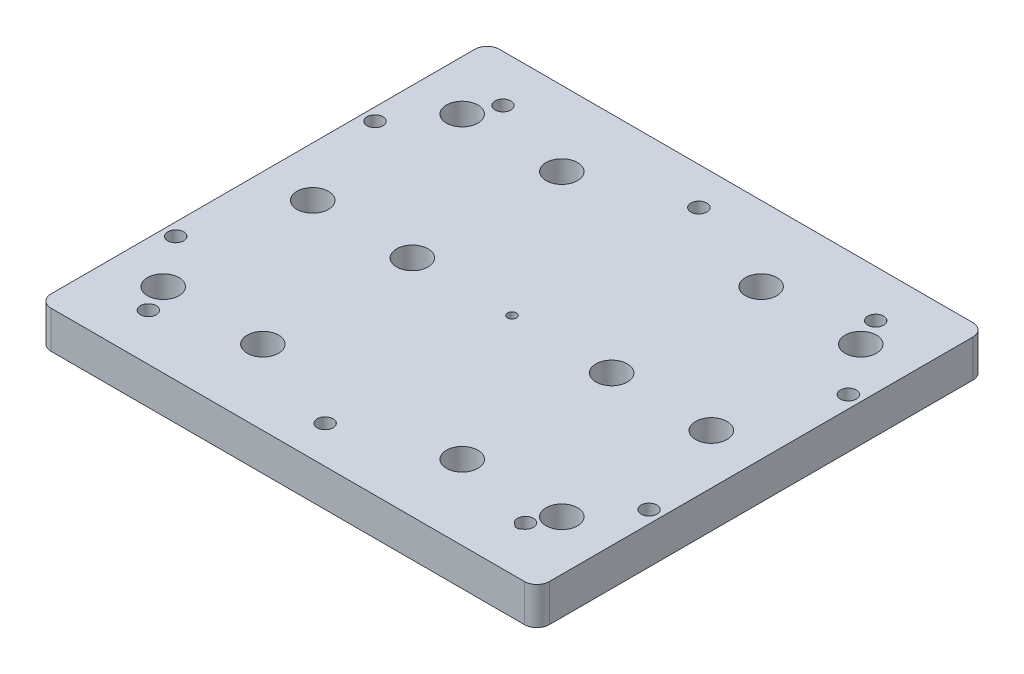
ISO-10303-21;
HEADER;
FILE_DESCRIPTION(('STEP AP214'),'2;1');
FILE_NAME('part.step','',(''),(''),'','','');
FILE_SCHEMA(('AUTOMOTIVE_DESIGN { 1 0 10303 214 1 1 1 1 }'));
ENDSEC;
DATA;
#1=APPLICATION_CONTEXT('core data for automotive mechanical design processes');
#2=APPLICATION_PROTOCOL_DEFINITION('international standard','automotive_design',2000,#1);
#3=PRODUCT_CONTEXT('',#1,'mechanical');
#4=PRODUCT('Part','Part','',(#3));
#5=PRODUCT_RELATED_PRODUCT_CATEGORY('part','',(#4));
#6=PRODUCT_DEFINITION_FORMATION('','',#4);
#7=PRODUCT_DEFINITION_CONTEXT('part definition',#1,'design');
#8=PRODUCT_DEFINITION('design','',#6,#7);
#9=PRODUCT_DEFINITION_SHAPE('','',#8);
#10=(LENGTH_UNIT() NAMED_UNIT(*) SI_UNIT(.MILLI.,.METRE.));
#11=(NAMED_UNIT(*) PLANE_ANGLE_UNIT() SI_UNIT($,.RADIAN.));
#12=(NAMED_UNIT(*) SI_UNIT($,.STERADIAN.) SOLID_ANGLE_UNIT());
#13=UNCERTAINTY_MEASURE_WITH_UNIT(LENGTH_MEASURE(1.E-05),#10,'distance_accuracy_value','');
#14=(GEOMETRIC_REPRESENTATION_CONTEXT(3) GLOBAL_UNCERTAINTY_ASSIGNED_CONTEXT((#13)) GLOBAL_UNIT_ASSIGNED_CONTEXT((#10,
#11,#12)) REPRESENTATION_CONTEXT('',''));
#15=CARTESIAN_POINT('',(0.,0.,0.));
#16=DIRECTION('',(0.,0.,1.));
#17=DIRECTION('',(1.,0.,0.));
#18=AXIS2_PLACEMENT_3D('',#15,#16,#17);
#19=CARTESIAN_POINT('',(-63.5,9.525,-57.15));
#20=DIRECTION('',(1.,0.,0.));
#21=DIRECTION('',(0.,0.,-1.));
#22=AXIS2_PLACEMENT_3D('',#19,#20,#21);
#23=PLANE('',#22);
#24=DIRECTION('',(0.,0.,1.));
#25=VECTOR('',#24,1.);
#26=CARTESIAN_POINT('',(-63.5,9.525,-57.15));
#27=LINE('',#26,#25);
#28=CARTESIAN_POINT('',(-63.5,9.525,-53.975));
#29=VERTEX_POINT('',#28);
#30=CARTESIAN_POINT('',(-63.5,9.525,53.975));
#31=VERTEX_POINT('',#30);
#32=EDGE_CURVE('E143',#29,#31,#27,.T.);
#33=ORIENTED_EDGE('',*,*,#32,.F.);
#34=DIRECTION('',(0.,-1.,0.));
#35=VECTOR('',#34,1.);
#36=CARTESIAN_POINT('',(-63.5,9.525,-53.975));
#37=LINE('',#36,#35);
#38=CARTESIAN_POINT('',(-63.5,0.,-53.975));
#39=VERTEX_POINT('',#38);
#40=EDGE_CURVE('E192',#29,#39,#37,.T.);
#41=ORIENTED_EDGE('',*,*,#40,.T.);
#42=DIRECTION('',(0.,0.,1.));
#43=VECTOR('',#42,1.);
#44=CARTESIAN_POINT('',(-63.5,0.,-57.15));
#45=LINE('',#44,#43);
#46=CARTESIAN_POINT('',(-63.5,0.,53.975));
#47=VERTEX_POINT('',#46);
#48=EDGE_CURVE('E142',#39,#47,#45,.T.);
#49=ORIENTED_EDGE('',*,*,#48,.T.);
#50=DIRECTION('',(0.,-1.,0.));
#51=VECTOR('',#50,1.);
#52=CARTESIAN_POINT('',(-63.5,9.525,53.975));
#53=LINE('',#52,#51);
#54=EDGE_CURVE('E190',#47,#31,#53,.F.);
#55=ORIENTED_EDGE('',*,*,#54,.T.);
#56=EDGE_LOOP('',(#33,#41,#49,#55));
#57=FACE_BOUND('',#56,.T.);
#58=ADVANCED_FACE('F37',(#57),#23,.F.);
#59=CARTESIAN_POINT('',(63.5,9.525,57.15));
#60=DIRECTION('',(0.,0.,-1.));
#61=DIRECTION('',(-1.,0.,0.));
#62=AXIS2_PLACEMENT_3D('',#59,#60,#61);
#63=PLANE('',#62);
#64=DIRECTION('',(1.,0.,0.));
#65=VECTOR('',#64,1.);
#66=CARTESIAN_POINT('',(63.5,0.,57.15));
#67=LINE('',#66,#65);
#68=CARTESIAN_POINT('',(-60.325,0.,57.15));
#69=VERTEX_POINT('',#68);
#70=CARTESIAN_POINT('',(60.325,0.,57.15));
#71=VERTEX_POINT('',#70);
#72=EDGE_CURVE('E158',#69,#71,#67,.T.);
#73=ORIENTED_EDGE('',*,*,#72,.T.);
#74=DIRECTION('',(0.,-1.,0.));
#75=VECTOR('',#74,1.);
#76=CARTESIAN_POINT('',(60.325,9.525,57.15));
#77=LINE('',#76,#75);
#78=CARTESIAN_POINT('',(60.325,9.525,57.15));
#79=VERTEX_POINT('',#78);
#80=EDGE_CURVE('E45',#71,#79,#77,.F.);
#81=ORIENTED_EDGE('',*,*,#80,.T.);
#82=DIRECTION('',(1.,0.,0.));
#83=VECTOR('',#82,1.);
#84=CARTESIAN_POINT('',(63.5,9.525,57.15));
#85=LINE('',#84,#83);
#86=CARTESIAN_POINT('',(-60.325,9.525,57.15));
#87=VERTEX_POINT('',#86);
#88=EDGE_CURVE('E146',#87,#79,#85,.T.);
#89=ORIENTED_EDGE('',*,*,#88,.F.);
#90=DIRECTION('',(0.,-1.,0.));
#91=VECTOR('',#90,1.);
#92=CARTESIAN_POINT('',(-60.325,9.525,57.15));
#93=LINE('',#92,#91);
#94=EDGE_CURVE('E195',#87,#69,#93,.T.);
#95=ORIENTED_EDGE('',*,*,#94,.T.);
#96=EDGE_LOOP('',(#73,#81,#89,#95));
#97=FACE_BOUND('',#96,.T.);
#98=ADVANCED_FACE('F199',(#97),#63,.F.);
#99=CARTESIAN_POINT('',(63.5,9.525,-57.15));
#100=DIRECTION('',(-1.,0.,0.));
#101=DIRECTION('',(0.,0.,1.));
#102=AXIS2_PLACEMENT_3D('',#99,#100,#101);
#103=PLANE('',#102);
#104=DIRECTION('',(0.,0.,-1.));
#105=VECTOR('',#104,1.);
#106=CARTESIAN_POINT('',(63.5,0.,-57.15));
#107=LINE('',#106,#105);
#108=CARTESIAN_POINT('',(63.5,0.,53.975));
#109=VERTEX_POINT('',#108);
#110=CARTESIAN_POINT('',(63.5,0.,-53.975));
#111=VERTEX_POINT('',#110);
#112=EDGE_CURVE('E160',#109,#111,#107,.T.);
#113=ORIENTED_EDGE('',*,*,#112,.T.);
#114=DIRECTION('',(0.,-1.,0.));
#115=VECTOR('',#114,1.);
#116=CARTESIAN_POINT('',(63.5,9.525,-53.975));
#117=LINE('',#116,#115);
#118=CARTESIAN_POINT('',(63.5,9.525,-53.975));
#119=VERTEX_POINT('',#118);
#120=EDGE_CURVE('E180',#111,#119,#117,.F.);
#121=ORIENTED_EDGE('',*,*,#120,.T.);
#122=DIRECTION('',(0.,0.,-1.));
#123=VECTOR('',#122,1.);
#124=CARTESIAN_POINT('',(63.5,9.525,-57.15));
#125=LINE('',#124,#123);
#126=CARTESIAN_POINT('',(63.5,9.525,53.975));
#127=VERTEX_POINT('',#126);
#128=EDGE_CURVE('E149',#127,#119,#125,.T.);
#129=ORIENTED_EDGE('',*,*,#128,.F.);
#130=DIRECTION('',(0.,-1.,0.));
#131=VECTOR('',#130,1.);
#132=CARTESIAN_POINT('',(63.5,9.525,53.975));
#133=LINE('',#132,#131);
#134=EDGE_CURVE('E177',#127,#109,#133,.T.);
#135=ORIENTED_EDGE('',*,*,#134,.T.);
#136=EDGE_LOOP('',(#113,#121,#129,#135));
#137=FACE_BOUND('',#136,.T.);
#138=ADVANCED_FACE('F213',(#137),#103,.F.);
#139=CARTESIAN_POINT('',(63.5,9.525,-57.15));
#140=DIRECTION('',(0.,0.,1.));
#141=DIRECTION('',(1.,0.,0.));
#142=AXIS2_PLACEMENT_3D('',#139,#140,#141);
#143=PLANE('',#142);
#144=DIRECTION('',(-1.,0.,0.));
#145=VECTOR('',#144,1.);
#146=CARTESIAN_POINT('',(63.5,9.525,-57.15));
#147=LINE('',#146,#145);
#148=CARTESIAN_POINT('',(60.325,9.525,-57.15));
#149=VERTEX_POINT('',#148);
#150=CARTESIAN_POINT('',(-60.325,9.525,-57.15));
#151=VERTEX_POINT('',#150);
#152=EDGE_CURVE('E152',#149,#151,#147,.T.);
#153=ORIENTED_EDGE('',*,*,#152,.F.);
#154=DIRECTION('',(0.,-1.,0.));
#155=VECTOR('',#154,1.);
#156=CARTESIAN_POINT('',(60.325,9.525,-57.15));
#157=LINE('',#156,#155);
#158=CARTESIAN_POINT('',(60.325,0.,-57.15));
#159=VERTEX_POINT('',#158);
#160=EDGE_CURVE('E166',#149,#159,#157,.T.);
#161=ORIENTED_EDGE('',*,*,#160,.T.);
#162=DIRECTION('',(-1.,0.,0.));
#163=VECTOR('',#162,1.);
#164=CARTESIAN_POINT('',(63.5,0.,-57.15));
#165=LINE('',#164,#163);
#166=CARTESIAN_POINT('',(-60.325,0.,-57.15));
#167=VERTEX_POINT('',#166);
#168=EDGE_CURVE('E147',#159,#167,#165,.T.);
#169=ORIENTED_EDGE('',*,*,#168,.T.);
#170=DIRECTION('',(0.,-1.,0.));
#171=VECTOR('',#170,1.);
#172=CARTESIAN_POINT('',(-60.325,9.525,-57.15));
#173=LINE('',#172,#171);
#174=EDGE_CURVE('E155',#167,#151,#173,.F.);
#175=ORIENTED_EDGE('',*,*,#174,.T.);
#176=EDGE_LOOP('',(#153,#161,#169,#175));
#177=FACE_BOUND('',#176,.T.);
#178=ADVANCED_FACE('F222',(#177),#143,.F.);
#179=CARTESIAN_POINT('',(0.,9.525,0.));
#180=DIRECTION('',(0.,-1.,0.));
#181=DIRECTION('',(0.,0.,-1.));
#182=AXIS2_PLACEMENT_3D('',#179,#180,#181);
#183=PLANE('',#182);
#184=CARTESIAN_POINT('',(50.8,9.525,-38.1));
#185=DIRECTION('',(0.,-1.,0.));
#186=DIRECTION('',(0.,0.,-1.));
#187=AXIS2_PLACEMENT_3D('',#184,#185,#186);
#188=CIRCLE('',#187,4.0132);
#189=CARTESIAN_POINT('',(50.8,9.525,-42.1132));
#190=VERTEX_POINT('',#189);
#191=EDGE_CURVE('E558',#190,#190,#188,.T.);
#192=ORIENTED_EDGE('',*,*,#191,.T.);
#193=EDGE_LOOP('',(#192));
#194=FACE_BOUND('',#193,.T.);
#195=CARTESIAN_POINT('',(25.4,9.525,-38.1));
#196=DIRECTION('',(0.,-1.,0.));
#197=DIRECTION('',(0.,0.,-1.));
#198=AXIS2_PLACEMENT_3D('',#195,#196,#197);
#199=CIRCLE('',#198,4.0132);
#200=CARTESIAN_POINT('',(25.4,9.525,-42.1132));
#201=VERTEX_POINT('',#200);
#202=EDGE_CURVE('E568',#201,#201,#199,.T.);
#203=ORIENTED_EDGE('',*,*,#202,.T.);
#204=EDGE_LOOP('',(#203));
#205=FACE_BOUND('',#204,.T.);
#206=CARTESIAN_POINT('',(25.4,9.525,0.));
#207=DIRECTION('',(0.,-1.,0.));
#208=DIRECTION('',(0.,0.,-1.));
#209=AXIS2_PLACEMENT_3D('',#206,#207,#208);
#210=CIRCLE('',#209,4.0132);
#211=CARTESIAN_POINT('',(25.4,9.525,-4.0132));
#212=VERTEX_POINT('',#211);
#213=EDGE_CURVE('E574',#212,#212,#210,.T.);
#214=ORIENTED_EDGE('',*,*,#213,.T.);
#215=EDGE_LOOP('',(#214));
#216=FACE_BOUND('',#215,.T.);
#217=CARTESIAN_POINT('',(50.8,9.525,0.));
#218=DIRECTION('',(0.,-1.,0.));
#219=DIRECTION('',(0.,0.,-1.));
#220=AXIS2_PLACEMENT_3D('',#217,#218,#219);
#221=CIRCLE('',#220,4.01319999999999);
#222=CARTESIAN_POINT('',(50.8,9.525,-4.01319999999999));
#223=VERTEX_POINT('',#222);
#224=EDGE_CURVE('E580',#223,#223,#221,.T.);
#225=ORIENTED_EDGE('',*,*,#224,.T.);
#226=EDGE_LOOP('',(#225));
#227=FACE_BOUND('',#226,.T.);
#228=CARTESIAN_POINT('',(50.8,9.525,38.1));
#229=DIRECTION('',(0.,-1.,0.));
#230=DIRECTION('',(0.,0.,-1.));
#231=AXIS2_PLACEMENT_3D('',#228,#229,#230);
#232=CIRCLE('',#231,4.01319999999999);
#233=CARTESIAN_POINT('',(50.8,9.525,34.0868));
#234=VERTEX_POINT('',#233);
#235=EDGE_CURVE('E586',#234,#234,#232,.T.);
#236=ORIENTED_EDGE('',*,*,#235,.T.);
#237=EDGE_LOOP('',(#236));
#238=FACE_BOUND('',#237,.T.);
#239=CARTESIAN_POINT('',(25.4,9.525,38.1));
#240=DIRECTION('',(0.,-1.,0.));
#241=DIRECTION('',(0.,0.,-1.));
#242=AXIS2_PLACEMENT_3D('',#239,#240,#241);
#243=CIRCLE('',#242,4.0132);
#244=CARTESIAN_POINT('',(25.4,9.525,34.0868));
#245=VERTEX_POINT('',#244);
#246=EDGE_CURVE('E592',#245,#245,#243,.T.);
#247=ORIENTED_EDGE('',*,*,#246,.T.);
#248=EDGE_LOOP('',(#247));
#249=FACE_BOUND('',#248,.T.);
#250=CARTESIAN_POINT('',(-25.4,9.525,38.1));
#251=DIRECTION('',(0.,-1.,0.));
#252=DIRECTION('',(0.,0.,-1.));
#253=AXIS2_PLACEMENT_3D('',#250,#251,#252);
#254=CIRCLE('',#253,4.0132);
#255=CARTESIAN_POINT('',(-25.4,9.525,34.0868));
#256=VERTEX_POINT('',#255);
#257=EDGE_CURVE('E598',#256,#256,#254,.T.);
#258=ORIENTED_EDGE('',*,*,#257,.T.);
#259=EDGE_LOOP('',(#258));
#260=FACE_BOUND('',#259,.T.);
#261=CARTESIAN_POINT('',(-50.8,9.525,38.1));
#262=DIRECTION('',(0.,-1.,0.));
#263=DIRECTION('',(0.,0.,-1.));
#264=AXIS2_PLACEMENT_3D('',#261,#262,#263);
#265=CIRCLE('',#264,4.01319999999999);
#266=CARTESIAN_POINT('',(-50.8,9.525,34.0868));
#267=VERTEX_POINT('',#266);
#268=EDGE_CURVE('E604',#267,#267,#265,.T.);
#269=ORIENTED_EDGE('',*,*,#268,.T.);
#270=EDGE_LOOP('',(#269));
#271=FACE_BOUND('',#270,.T.);
#272=CARTESIAN_POINT('',(-50.8,9.525,0.));
#273=DIRECTION('',(0.,-1.,0.));
#274=DIRECTION('',(0.,0.,-1.));
#275=AXIS2_PLACEMENT_3D('',#272,#273,#274);
#276=CIRCLE('',#275,4.01319999999999);
#277=CARTESIAN_POINT('',(-50.8,9.525,-4.01319999999999));
#278=VERTEX_POINT('',#277);
#279=EDGE_CURVE('E610',#278,#278,#276,.T.);
#280=ORIENTED_EDGE('',*,*,#279,.T.);
#281=EDGE_LOOP('',(#280));
#282=FACE_BOUND('',#281,.T.);
#283=CARTESIAN_POINT('',(-25.4,9.525,0.));
#284=DIRECTION('',(0.,-1.,0.));
#285=DIRECTION('',(0.,0.,-1.));
#286=AXIS2_PLACEMENT_3D('',#283,#284,#285);
#287=CIRCLE('',#286,4.0132);
#288=CARTESIAN_POINT('',(-25.4,9.525,-4.0132));
#289=VERTEX_POINT('',#288);
#290=EDGE_CURVE('E616',#289,#289,#287,.T.);
#291=ORIENTED_EDGE('',*,*,#290,.T.);
#292=EDGE_LOOP('',(#291));
#293=FACE_BOUND('',#292,.T.);
#294=CARTESIAN_POINT('',(-25.4,9.525,-38.1));
#295=DIRECTION('',(0.,-1.,0.));
#296=DIRECTION('',(0.,0.,-1.));
#297=AXIS2_PLACEMENT_3D('',#294,#295,#296);
#298=CIRCLE('',#297,4.0132);
#299=CARTESIAN_POINT('',(-25.4,9.525,-42.1132));
#300=VERTEX_POINT('',#299);
#301=EDGE_CURVE('E622',#300,#300,#298,.T.);
#302=ORIENTED_EDGE('',*,*,#301,.T.);
#303=EDGE_LOOP('',(#302));
#304=FACE_BOUND('',#303,.T.);
#305=CARTESIAN_POINT('',(-50.8,9.525,-38.1));
#306=DIRECTION('',(0.,-1.,0.));
#307=DIRECTION('',(0.,0.,-1.));
#308=AXIS2_PLACEMENT_3D('',#305,#306,#307);
#309=CIRCLE('',#308,4.01319999999999);
#310=CARTESIAN_POINT('',(-50.8,9.525,-42.1132));
#311=VERTEX_POINT('',#310);
#312=EDGE_CURVE('E628',#311,#311,#309,.T.);
#313=ORIENTED_EDGE('',*,*,#312,.T.);
#314=EDGE_LOOP('',(#313));
#315=FACE_BOUND('',#314,.T.);
#316=CARTESIAN_POINT('',(47.499999996,9.525,-45.200000024));
#317=DIRECTION('',(0.,-1.,0.));
#318=DIRECTION('',(0.,0.,-1.));
#319=AXIS2_PLACEMENT_3D('',#316,#317,#318);
#320=CIRCLE('',#319,2.0193);
#321=CARTESIAN_POINT('',(47.499999996,9.525,-47.219300024));
#322=VERTEX_POINT('',#321);
#323=EDGE_CURVE('E634',#322,#322,#320,.T.);
#324=ORIENTED_EDGE('',*,*,#323,.T.);
#325=EDGE_LOOP('',(#324));
#326=FACE_BOUND('',#325,.T.);
#327=CARTESIAN_POINT('',(60.325,9.525,-25.4));
#328=DIRECTION('',(0.,-1.,0.));
#329=DIRECTION('',(0.,0.,-1.));
#330=AXIS2_PLACEMENT_3D('',#327,#328,#329);
#331=CIRCLE('',#330,2.01929999999999);
#332=CARTESIAN_POINT('',(60.325,9.525,-27.4193));
#333=VERTEX_POINT('',#332);
#334=EDGE_CURVE('E640',#333,#333,#331,.T.);
#335=ORIENTED_EDGE('',*,*,#334,.T.);
#336=EDGE_LOOP('',(#335));
#337=FACE_BOUND('',#336,.T.);
#338=CARTESIAN_POINT('',(60.325,9.525,25.4));
#339=DIRECTION('',(0.,-1.,0.));
#340=DIRECTION('',(0.,0.,-1.));
#341=AXIS2_PLACEMENT_3D('',#338,#339,#340);
#342=CIRCLE('',#341,2.0193);
#343=CARTESIAN_POINT('',(60.325,9.525,23.3807));
#344=VERTEX_POINT('',#343);
#345=EDGE_CURVE('E646',#344,#344,#342,.T.);
#346=ORIENTED_EDGE('',*,*,#345,.T.);
#347=EDGE_LOOP('',(#346));
#348=FACE_BOUND('',#347,.T.);
#349=CARTESIAN_POINT('',(0.,9.525,47.625));
#350=DIRECTION('',(0.,-1.,0.));
#351=DIRECTION('',(0.,0.,-1.));
#352=AXIS2_PLACEMENT_3D('',#349,#350,#351);
#353=CIRCLE('',#352,2.0193);
#354=CARTESIAN_POINT('',(0.,9.525,45.6057));
#355=VERTEX_POINT('',#354);
#356=EDGE_CURVE('E654',#355,#355,#353,.T.);
#357=ORIENTED_EDGE('',*,*,#356,.T.);
#358=EDGE_LOOP('',(#357));
#359=FACE_BOUND('',#358,.T.);
#360=CARTESIAN_POINT('',(-47.499999996,9.525,45.200000024));
#361=DIRECTION('',(0.,-1.,0.));
#362=DIRECTION('',(0.,0.,-1.));
#363=AXIS2_PLACEMENT_3D('',#360,#361,#362);
#364=CIRCLE('',#363,2.01929999999999);
#365=CARTESIAN_POINT('',(-47.499999996,9.525,43.180700024));
#366=VERTEX_POINT('',#365);
#367=EDGE_CURVE('E660',#366,#366,#364,.T.);
#368=ORIENTED_EDGE('',*,*,#367,.T.);
#369=EDGE_LOOP('',(#368));
#370=FACE_BOUND('',#369,.T.);
#371=CARTESIAN_POINT('',(-60.325,9.525,25.4));
#372=DIRECTION('',(0.,-1.,0.));
#373=DIRECTION('',(0.,0.,-1.));
#374=AXIS2_PLACEMENT_3D('',#371,#372,#373);
#375=CIRCLE('',#374,2.01929999999999);
#376=CARTESIAN_POINT('',(-60.325,9.525,23.3807));
#377=VERTEX_POINT('',#376);
#378=EDGE_CURVE('E666',#377,#377,#375,.T.);
#379=ORIENTED_EDGE('',*,*,#378,.T.);
#380=EDGE_LOOP('',(#379));
#381=FACE_BOUND('',#380,.T.);
#382=CARTESIAN_POINT('',(-60.325,9.525,-25.4));
#383=DIRECTION('',(0.,-1.,0.));
#384=DIRECTION('',(0.,0.,-1.));
#385=AXIS2_PLACEMENT_3D('',#382,#383,#384);
#386=CIRCLE('',#385,2.01929999999999);
#387=CARTESIAN_POINT('',(-60.325,9.525,-27.4193));
#388=VERTEX_POINT('',#387);
#389=EDGE_CURVE('E672',#388,#388,#386,.T.);
#390=ORIENTED_EDGE('',*,*,#389,.T.);
#391=EDGE_LOOP('',(#390));
#392=FACE_BOUND('',#391,.T.);
#393=CARTESIAN_POINT('',(-47.499999996,9.525,-45.200000024));
#394=DIRECTION('',(0.,-1.,0.));
#395=DIRECTION('',(0.,0.,-1.));
#396=AXIS2_PLACEMENT_3D('',#393,#394,#395);
#397=CIRCLE('',#396,2.01929999999999);
#398=CARTESIAN_POINT('',(-47.499999996,9.525,-47.219300024));
#399=VERTEX_POINT('',#398);
#400=EDGE_CURVE('E678',#399,#399,#397,.T.);
#401=ORIENTED_EDGE('',*,*,#400,.T.);
#402=EDGE_LOOP('',(#401));
#403=FACE_BOUND('',#402,.T.);
#404=CARTESIAN_POINT('',(0.,9.525,-47.625));
#405=DIRECTION('',(0.,-1.,0.));
#406=DIRECTION('',(0.,0.,-1.));
#407=AXIS2_PLACEMENT_3D('',#404,#405,#406);
#408=CIRCLE('',#407,2.0193);
#409=CARTESIAN_POINT('',(0.,9.525,-49.6443));
#410=VERTEX_POINT('',#409);
#411=EDGE_CURVE('E128',#410,#410,#408,.T.);
#412=ORIENTED_EDGE('',*,*,#411,.T.);
#413=EDGE_LOOP('',(#412));
#414=FACE_BOUND('',#413,.T.);
#415=CARTESIAN_POINT('',(47.499999996,9.525,45.200000024));
#416=DIRECTION('',(0.,1.,0.));
#417=DIRECTION('',(0.,0.,1.));
#418=AXIS2_PLACEMENT_3D('',#415,#416,#417);
#419=CIRCLE('',#418,1.1303);
#420=CARTESIAN_POINT('',(46.5922367519601,9.525,45.873456765573));
#421=VERTEX_POINT('',#420);
#422=CARTESIAN_POINT('',(48.4077632400399,9.525,45.873456765573));
#423=VERTEX_POINT('',#422);
#424=EDGE_CURVE('E121',#421,#423,#419,.T.);
#425=ORIENTED_EDGE('',*,*,#424,.F.);
#426=CARTESIAN_POINT('',(47.499999996,9.525,44.069700024));
#427=DIRECTION('',(0.,-1.,0.));
#428=DIRECTION('',(0.,0.,-1.));
#429=AXIS2_PLACEMENT_3D('',#426,#427,#428);
#430=CIRCLE('',#429,2.0193);
#431=EDGE_CURVE('E11',#421,#423,#430,.T.);
#432=ORIENTED_EDGE('',*,*,#431,.T.);
#433=EDGE_LOOP('',(#425,#432));
#434=FACE_BOUND('',#433,.T.);
#435=CARTESIAN_POINT('',(0.,9.525,0.));
#436=DIRECTION('',(0.,1.,0.));
#437=DIRECTION('',(0.,0.,1.));
#438=AXIS2_PLACEMENT_3D('',#435,#436,#437);
#439=CIRCLE('',#438,1.1303);
#440=CARTESIAN_POINT('',(0.,9.525,1.1303));
#441=VERTEX_POINT('',#440);
#442=EDGE_CURVE('E130',#441,#441,#439,.T.);
#443=ORIENTED_EDGE('',*,*,#442,.F.);
#444=EDGE_LOOP('',(#443));
#445=FACE_BOUND('',#444,.T.);
#446=ORIENTED_EDGE('',*,*,#128,.T.);
#447=CARTESIAN_POINT('',(60.325,9.525,-53.975));
#448=DIRECTION('',(0.,-1.,0.));
#449=DIRECTION('',(0.,0.,-1.));
#450=AXIS2_PLACEMENT_3D('',#447,#448,#449);
#451=CIRCLE('',#450,3.175);
#452=EDGE_CURVE('E188',#119,#149,#451,.F.);
#453=ORIENTED_EDGE('',*,*,#452,.T.);
#454=ORIENTED_EDGE('',*,*,#152,.T.);
#455=CARTESIAN_POINT('',(-60.325,9.525,-53.975));
#456=DIRECTION('',(0.,-1.,0.));
#457=DIRECTION('',(0.,0.,-1.));
#458=AXIS2_PLACEMENT_3D('',#455,#456,#457);
#459=CIRCLE('',#458,3.175);
#460=EDGE_CURVE('E186',#151,#29,#459,.F.);
#461=ORIENTED_EDGE('',*,*,#460,.T.);
#462=ORIENTED_EDGE('',*,*,#32,.T.);
#463=CARTESIAN_POINT('',(-60.325,9.525,53.975));
#464=DIRECTION('',(0.,-1.,0.));
#465=DIRECTION('',(0.,0.,-1.));
#466=AXIS2_PLACEMENT_3D('',#463,#464,#465);
#467=CIRCLE('',#466,3.175);
#468=EDGE_CURVE('E182',#31,#87,#467,.F.);
#469=ORIENTED_EDGE('',*,*,#468,.T.);
#470=ORIENTED_EDGE('',*,*,#88,.T.);
#471=CARTESIAN_POINT('',(60.325,9.525,53.975));
#472=DIRECTION('',(0.,-1.,0.));
#473=DIRECTION('',(0.,0.,-1.));
#474=AXIS2_PLACEMENT_3D('',#471,#472,#473);
#475=CIRCLE('',#474,3.175);
#476=EDGE_CURVE('E184',#79,#127,#475,.F.);
#477=ORIENTED_EDGE('',*,*,#476,.T.);
#478=EDGE_LOOP('',(#446,#453,#454,#461,#462,#469,#470,#477));
#479=FACE_BOUND('',#478,.T.);
#480=ADVANCED_FACE('F126',(#194,#205,#216,#227,#238,#249,#260,#271,#282,#293,#304,#315,#326,
#337,#348,#359,#370,#381,#392,#403,#414,#434,#445,#479),#183,.F.);
#481=CARTESIAN_POINT('',(0.,0.,0.));
#482=DIRECTION('',(0.,-1.,0.));
#483=DIRECTION('',(0.,0.,-1.));
#484=AXIS2_PLACEMENT_3D('',#481,#482,#483);
#485=PLANE('',#484);
#486=CARTESIAN_POINT('',(50.8,0.,-38.1));
#487=DIRECTION('',(0.,-1.,0.));
#488=DIRECTION('',(0.,0.,-1.));
#489=AXIS2_PLACEMENT_3D('',#486,#487,#488);
#490=CIRCLE('',#489,4.0132);
#491=CARTESIAN_POINT('',(50.8,0.,-42.1132));
#492=VERTEX_POINT('',#491);
#493=EDGE_CURVE('E561',#492,#492,#490,.T.);
#494=ORIENTED_EDGE('',*,*,#493,.F.);
#495=EDGE_LOOP('',(#494));
#496=FACE_BOUND('',#495,.T.);
#497=CARTESIAN_POINT('',(25.4,0.,-38.1));
#498=DIRECTION('',(0.,-1.,0.));
#499=DIRECTION('',(0.,0.,-1.));
#500=AXIS2_PLACEMENT_3D('',#497,#498,#499);
#501=CIRCLE('',#500,4.0132);
#502=CARTESIAN_POINT('',(25.4,0.,-42.1132));
#503=VERTEX_POINT('',#502);
#504=EDGE_CURVE('E563',#503,#503,#501,.T.);
#505=ORIENTED_EDGE('',*,*,#504,.F.);
#506=EDGE_LOOP('',(#505));
#507=FACE_BOUND('',#506,.T.);
#508=CARTESIAN_POINT('',(25.4,0.,0.));
#509=DIRECTION('',(0.,-1.,0.));
#510=DIRECTION('',(0.,0.,-1.));
#511=AXIS2_PLACEMENT_3D('',#508,#509,#510);
#512=CIRCLE('',#511,4.0132);
#513=CARTESIAN_POINT('',(25.4,0.,-4.0132));
#514=VERTEX_POINT('',#513);
#515=EDGE_CURVE('E571',#514,#514,#512,.T.);
#516=ORIENTED_EDGE('',*,*,#515,.F.);
#517=EDGE_LOOP('',(#516));
#518=FACE_BOUND('',#517,.T.);
#519=CARTESIAN_POINT('',(50.8,0.,0.));
#520=DIRECTION('',(0.,-1.,0.));
#521=DIRECTION('',(0.,0.,-1.));
#522=AXIS2_PLACEMENT_3D('',#519,#520,#521);
#523=CIRCLE('',#522,4.0132);
#524=CARTESIAN_POINT('',(50.8,0.,-4.0132));
#525=VERTEX_POINT('',#524);
#526=EDGE_CURVE('E577',#525,#525,#523,.T.);
#527=ORIENTED_EDGE('',*,*,#526,.F.);
#528=EDGE_LOOP('',(#527));
#529=FACE_BOUND('',#528,.T.);
#530=CARTESIAN_POINT('',(50.8,0.,38.1));
#531=DIRECTION('',(0.,-1.,0.));
#532=DIRECTION('',(0.,0.,-1.));
#533=AXIS2_PLACEMENT_3D('',#530,#531,#532);
#534=CIRCLE('',#533,4.0132);
#535=CARTESIAN_POINT('',(50.8,0.,34.0868));
#536=VERTEX_POINT('',#535);
#537=EDGE_CURVE('E583',#536,#536,#534,.T.);
#538=ORIENTED_EDGE('',*,*,#537,.F.);
#539=EDGE_LOOP('',(#538));
#540=FACE_BOUND('',#539,.T.);
#541=CARTESIAN_POINT('',(25.4,0.,38.1));
#542=DIRECTION('',(0.,-1.,0.));
#543=DIRECTION('',(0.,0.,-1.));
#544=AXIS2_PLACEMENT_3D('',#541,#542,#543);
#545=CIRCLE('',#544,4.0132);
#546=CARTESIAN_POINT('',(25.4,0.,34.0868));
#547=VERTEX_POINT('',#546);
#548=EDGE_CURVE('E589',#547,#547,#545,.T.);
#549=ORIENTED_EDGE('',*,*,#548,.F.);
#550=EDGE_LOOP('',(#549));
#551=FACE_BOUND('',#550,.T.);
#552=CARTESIAN_POINT('',(-25.4,0.,38.1));
#553=DIRECTION('',(0.,-1.,0.));
#554=DIRECTION('',(0.,0.,-1.));
#555=AXIS2_PLACEMENT_3D('',#552,#553,#554);
#556=CIRCLE('',#555,4.0132);
#557=CARTESIAN_POINT('',(-25.4,0.,34.0868));
#558=VERTEX_POINT('',#557);
#559=EDGE_CURVE('E595',#558,#558,#556,.T.);
#560=ORIENTED_EDGE('',*,*,#559,.F.);
#561=EDGE_LOOP('',(#560));
#562=FACE_BOUND('',#561,.T.);
#563=CARTESIAN_POINT('',(-50.8,0.,38.1));
#564=DIRECTION('',(0.,-1.,0.));
#565=DIRECTION('',(0.,0.,-1.));
#566=AXIS2_PLACEMENT_3D('',#563,#564,#565);
#567=CIRCLE('',#566,4.0132);
#568=CARTESIAN_POINT('',(-50.8,0.,34.0868));
#569=VERTEX_POINT('',#568);
#570=EDGE_CURVE('E601',#569,#569,#567,.T.);
#571=ORIENTED_EDGE('',*,*,#570,.F.);
#572=EDGE_LOOP('',(#571));
#573=FACE_BOUND('',#572,.T.);
#574=CARTESIAN_POINT('',(-50.8,0.,0.));
#575=DIRECTION('',(0.,-1.,0.));
#576=DIRECTION('',(0.,0.,-1.));
#577=AXIS2_PLACEMENT_3D('',#574,#575,#576);
#578=CIRCLE('',#577,4.0132);
#579=CARTESIAN_POINT('',(-50.8,0.,-4.0132));
#580=VERTEX_POINT('',#579);
#581=EDGE_CURVE('E607',#580,#580,#578,.T.);
#582=ORIENTED_EDGE('',*,*,#581,.F.);
#583=EDGE_LOOP('',(#582));
#584=FACE_BOUND('',#583,.T.);
#585=CARTESIAN_POINT('',(-25.4,0.,0.));
#586=DIRECTION('',(0.,-1.,0.));
#587=DIRECTION('',(0.,0.,-1.));
#588=AXIS2_PLACEMENT_3D('',#585,#586,#587);
#589=CIRCLE('',#588,4.0132);
#590=CARTESIAN_POINT('',(-25.4,0.,-4.0132));
#591=VERTEX_POINT('',#590);
#592=EDGE_CURVE('E613',#591,#591,#589,.T.);
#593=ORIENTED_EDGE('',*,*,#592,.F.);
#594=EDGE_LOOP('',(#593));
#595=FACE_BOUND('',#594,.T.);
#596=CARTESIAN_POINT('',(-25.4,0.,-38.1));
#597=DIRECTION('',(0.,-1.,0.));
#598=DIRECTION('',(0.,0.,-1.));
#599=AXIS2_PLACEMENT_3D('',#596,#597,#598);
#600=CIRCLE('',#599,4.0132);
#601=CARTESIAN_POINT('',(-25.4,0.,-42.1132));
#602=VERTEX_POINT('',#601);
#603=EDGE_CURVE('E619',#602,#602,#600,.T.);
#604=ORIENTED_EDGE('',*,*,#603,.F.);
#605=EDGE_LOOP('',(#604));
#606=FACE_BOUND('',#605,.T.);
#607=CARTESIAN_POINT('',(-50.8,0.,-38.1));
#608=DIRECTION('',(0.,-1.,0.));
#609=DIRECTION('',(0.,0.,-1.));
#610=AXIS2_PLACEMENT_3D('',#607,#608,#609);
#611=CIRCLE('',#610,4.0132);
#612=CARTESIAN_POINT('',(-50.8,0.,-42.1132));
#613=VERTEX_POINT('',#612);
#614=EDGE_CURVE('E625',#613,#613,#611,.T.);
#615=ORIENTED_EDGE('',*,*,#614,.F.);
#616=EDGE_LOOP('',(#615));
#617=FACE_BOUND('',#616,.T.);
#618=CARTESIAN_POINT('',(47.499999996,0.,-45.200000024));
#619=DIRECTION('',(0.,-1.,0.));
#620=DIRECTION('',(0.,0.,-1.));
#621=AXIS2_PLACEMENT_3D('',#618,#619,#620);
#622=CIRCLE('',#621,2.0193);
#623=CARTESIAN_POINT('',(47.499999996,0.,-47.219300024));
#624=VERTEX_POINT('',#623);
#625=EDGE_CURVE('E631',#624,#624,#622,.T.);
#626=ORIENTED_EDGE('',*,*,#625,.F.);
#627=EDGE_LOOP('',(#626));
#628=FACE_BOUND('',#627,.T.);
#629=CARTESIAN_POINT('',(60.325,0.,-25.4));
#630=DIRECTION('',(0.,-1.,0.));
#631=DIRECTION('',(0.,0.,-1.));
#632=AXIS2_PLACEMENT_3D('',#629,#630,#631);
#633=CIRCLE('',#632,2.0193);
#634=CARTESIAN_POINT('',(60.325,0.,-27.4193));
#635=VERTEX_POINT('',#634);
#636=EDGE_CURVE('E637',#635,#635,#633,.T.);
#637=ORIENTED_EDGE('',*,*,#636,.F.);
#638=EDGE_LOOP('',(#637));
#639=FACE_BOUND('',#638,.T.);
#640=CARTESIAN_POINT('',(60.325,0.,25.4));
#641=DIRECTION('',(0.,-1.,0.));
#642=DIRECTION('',(0.,0.,-1.));
#643=AXIS2_PLACEMENT_3D('',#640,#641,#642);
#644=CIRCLE('',#643,2.0193);
#645=CARTESIAN_POINT('',(60.325,0.,23.3807));
#646=VERTEX_POINT('',#645);
#647=EDGE_CURVE('E643',#646,#646,#644,.T.);
#648=ORIENTED_EDGE('',*,*,#647,.F.);
#649=EDGE_LOOP('',(#648));
#650=FACE_BOUND('',#649,.T.);
#651=CARTESIAN_POINT('',(47.499999996,0.,44.069700024));
#652=DIRECTION('',(0.,-1.,0.));
#653=DIRECTION('',(0.,0.,-1.));
#654=AXIS2_PLACEMENT_3D('',#651,#652,#653);
#655=CIRCLE('',#654,2.0193);
#656=CARTESIAN_POINT('',(46.5922367519601,0.,45.873456765573));
#657=VERTEX_POINT('',#656);
#658=CARTESIAN_POINT('',(48.4077632400399,0.,45.873456765573));
#659=VERTEX_POINT('',#658);
#660=EDGE_CURVE('E649',#657,#659,#655,.T.);
#661=ORIENTED_EDGE('',*,*,#660,.F.);
#662=CARTESIAN_POINT('',(47.499999996,0.,45.200000024));
#663=DIRECTION('',(0.,1.,0.));
#664=DIRECTION('',(0.,0.,1.));
#665=AXIS2_PLACEMENT_3D('',#662,#663,#664);
#666=CIRCLE('',#665,1.1303);
#667=EDGE_CURVE('E123',#657,#659,#666,.T.);
#668=ORIENTED_EDGE('',*,*,#667,.T.);
#669=EDGE_LOOP('',(#661,#668));
#670=FACE_BOUND('',#669,.T.);
#671=CARTESIAN_POINT('',(0.,0.,47.625));
#672=DIRECTION('',(0.,-1.,0.));
#673=DIRECTION('',(0.,0.,-1.));
#674=AXIS2_PLACEMENT_3D('',#671,#672,#673);
#675=CIRCLE('',#674,2.0193);
#676=CARTESIAN_POINT('',(0.,0.,45.6057));
#677=VERTEX_POINT('',#676);
#678=EDGE_CURVE('E124',#677,#677,#675,.T.);
#679=ORIENTED_EDGE('',*,*,#678,.F.);
#680=EDGE_LOOP('',(#679));
#681=FACE_BOUND('',#680,.T.);
#682=CARTESIAN_POINT('',(-47.499999996,0.,45.200000024));
#683=DIRECTION('',(0.,-1.,0.));
#684=DIRECTION('',(0.,0.,-1.));
#685=AXIS2_PLACEMENT_3D('',#682,#683,#684);
#686=CIRCLE('',#685,2.0193);
#687=CARTESIAN_POINT('',(-47.499999996,0.,43.180700024));
#688=VERTEX_POINT('',#687);
#689=EDGE_CURVE('E657',#688,#688,#686,.T.);
#690=ORIENTED_EDGE('',*,*,#689,.F.);
#691=EDGE_LOOP('',(#690));
#692=FACE_BOUND('',#691,.T.);
#693=CARTESIAN_POINT('',(-60.325,0.,25.4));
#694=DIRECTION('',(0.,-1.,0.));
#695=DIRECTION('',(0.,0.,-1.));
#696=AXIS2_PLACEMENT_3D('',#693,#694,#695);
#697=CIRCLE('',#696,2.0193);
#698=CARTESIAN_POINT('',(-60.325,0.,23.3807));
#699=VERTEX_POINT('',#698);
#700=EDGE_CURVE('E663',#699,#699,#697,.T.);
#701=ORIENTED_EDGE('',*,*,#700,.F.);
#702=EDGE_LOOP('',(#701));
#703=FACE_BOUND('',#702,.T.);
#704=CARTESIAN_POINT('',(-60.325,0.,-25.4));
#705=DIRECTION('',(0.,-1.,0.));
#706=DIRECTION('',(0.,0.,-1.));
#707=AXIS2_PLACEMENT_3D('',#704,#705,#706);
#708=CIRCLE('',#707,2.0193);
#709=CARTESIAN_POINT('',(-60.325,0.,-27.4193));
#710=VERTEX_POINT('',#709);
#711=EDGE_CURVE('E669',#710,#710,#708,.T.);
#712=ORIENTED_EDGE('',*,*,#711,.F.);
#713=EDGE_LOOP('',(#712));
#714=FACE_BOUND('',#713,.T.);
#715=CARTESIAN_POINT('',(-47.499999996,0.,-45.200000024));
#716=DIRECTION('',(0.,-1.,0.));
#717=DIRECTION('',(0.,0.,-1.));
#718=AXIS2_PLACEMENT_3D('',#715,#716,#717);
#719=CIRCLE('',#718,2.0193);
#720=CARTESIAN_POINT('',(-47.499999996,0.,-47.219300024));
#721=VERTEX_POINT('',#720);
#722=EDGE_CURVE('E675',#721,#721,#719,.T.);
#723=ORIENTED_EDGE('',*,*,#722,.F.);
#724=EDGE_LOOP('',(#723));
#725=FACE_BOUND('',#724,.T.);
#726=CARTESIAN_POINT('',(0.,0.,-47.625));
#727=DIRECTION('',(0.,-1.,0.));
#728=DIRECTION('',(0.,0.,-1.));
#729=AXIS2_PLACEMENT_3D('',#726,#727,#728);
#730=CIRCLE('',#729,2.0193);
#731=CARTESIAN_POINT('',(0.,0.,-49.6443));
#732=VERTEX_POINT('',#731);
#733=EDGE_CURVE('E133',#732,#732,#730,.T.);
#734=ORIENTED_EDGE('',*,*,#733,.F.);
#735=EDGE_LOOP('',(#734));
#736=FACE_BOUND('',#735,.T.);
#737=CARTESIAN_POINT('',(0.,0.,0.));
#738=DIRECTION('',(0.,1.,0.));
#739=DIRECTION('',(0.,0.,1.));
#740=AXIS2_PLACEMENT_3D('',#737,#738,#739);
#741=CIRCLE('',#740,1.1303);
#742=CARTESIAN_POINT('',(0.,0.,1.1303));
#743=VERTEX_POINT('',#742);
#744=EDGE_CURVE('E139',#743,#743,#741,.T.);
#745=ORIENTED_EDGE('',*,*,#744,.T.);
#746=EDGE_LOOP('',(#745));
#747=FACE_BOUND('',#746,.T.);
#748=ORIENTED_EDGE('',*,*,#168,.F.);
#749=CARTESIAN_POINT('',(60.325,0.,-53.975));
#750=DIRECTION('',(0.,-1.,0.));
#751=DIRECTION('',(0.,0.,-1.));
#752=AXIS2_PLACEMENT_3D('',#749,#750,#751);
#753=CIRCLE('',#752,3.175);
#754=EDGE_CURVE('E175',#159,#111,#753,.T.);
#755=ORIENTED_EDGE('',*,*,#754,.T.);
#756=ORIENTED_EDGE('',*,*,#112,.F.);
#757=CARTESIAN_POINT('',(60.325,0.,53.975));
#758=DIRECTION('',(0.,-1.,0.));
#759=DIRECTION('',(0.,0.,-1.));
#760=AXIS2_PLACEMENT_3D('',#757,#758,#759);
#761=CIRCLE('',#760,3.175);
#762=EDGE_CURVE('E171',#109,#71,#761,.T.);
#763=ORIENTED_EDGE('',*,*,#762,.T.);
#764=ORIENTED_EDGE('',*,*,#72,.F.);
#765=CARTESIAN_POINT('',(-60.325,0.,53.975));
#766=DIRECTION('',(0.,-1.,0.));
#767=DIRECTION('',(0.,0.,-1.));
#768=AXIS2_PLACEMENT_3D('',#765,#766,#767);
#769=CIRCLE('',#768,3.175);
#770=EDGE_CURVE('E169',#69,#47,#769,.T.);
#771=ORIENTED_EDGE('',*,*,#770,.T.);
#772=ORIENTED_EDGE('',*,*,#48,.F.);
#773=CARTESIAN_POINT('',(-60.325,0.,-53.975));
#774=DIRECTION('',(0.,-1.,0.));
#775=DIRECTION('',(0.,0.,-1.));
#776=AXIS2_PLACEMENT_3D('',#773,#774,#775);
#777=CIRCLE('',#776,3.175);
#778=EDGE_CURVE('E173',#39,#167,#777,.T.);
#779=ORIENTED_EDGE('',*,*,#778,.T.);
#780=EDGE_LOOP('',(#748,#755,#756,#763,#764,#771,#772,#779));
#781=FACE_BOUND('',#780,.T.);
#782=ADVANCED_FACE('F204',(#496,#507,#518,#529,#540,#551,#562,#573,#584,#595,#606,#617,#628,
#639,#650,#670,#681,#692,#703,#714,#725,#736,#747,#781),#485,.T.);
#783=CARTESIAN_POINT('',(0.,9.525,0.));
#784=DIRECTION('',(0.,1.,0.));
#785=DIRECTION('',(0.,0.,1.));
#786=AXIS2_PLACEMENT_3D('',#783,#784,#785);
#787=CYLINDRICAL_SURFACE('',#786,1.1303);
#788=ORIENTED_EDGE('',*,*,#744,.F.);
#789=EDGE_LOOP('',(#788));
#790=FACE_BOUND('',#789,.T.);
#791=ORIENTED_EDGE('',*,*,#442,.T.);
#792=EDGE_LOOP('',(#791));
#793=FACE_BOUND('',#792,.T.);
#794=ADVANCED_FACE('F273',(#790,#793),#787,.F.);
#795=CARTESIAN_POINT('',(47.499999996,9.525,45.200000024));
#796=DIRECTION('',(0.,1.,0.));
#797=DIRECTION('',(0.,0.,1.));
#798=AXIS2_PLACEMENT_3D('',#795,#796,#797);
#799=CYLINDRICAL_SURFACE('',#798,1.1303);
#800=ORIENTED_EDGE('',*,*,#667,.F.);
#801=DIRECTION('',(0.,-1.,0.));
#802=VECTOR('',#801,1.);
#803=CARTESIAN_POINT('',(46.5922367519601,4.7625,45.873456765573));
#804=LINE('',#803,#802);
#805=EDGE_CURVE('E113',#657,#421,#804,.F.);
#806=ORIENTED_EDGE('',*,*,#805,.T.);
#807=ORIENTED_EDGE('',*,*,#424,.T.);
#808=DIRECTION('',(0.,-1.,0.));
#809=VECTOR('',#808,1.);
#810=CARTESIAN_POINT('',(48.4077632400399,4.7625,45.873456765573));
#811=LINE('',#810,#809);
#812=EDGE_CURVE('E52',#423,#659,#811,.T.);
#813=ORIENTED_EDGE('',*,*,#812,.T.);
#814=EDGE_LOOP('',(#800,#806,#807,#813));
#815=FACE_BOUND('',#814,.T.);
#816=ADVANCED_FACE('F120',(#815),#799,.F.);
#817=CARTESIAN_POINT('',(60.325,9.525,-53.975));
#818=DIRECTION('',(0.,-1.,0.));
#819=DIRECTION('',(0.,0.,-1.));
#820=AXIS2_PLACEMENT_3D('',#817,#818,#819);
#821=CYLINDRICAL_SURFACE('',#820,3.175);
#822=ORIENTED_EDGE('',*,*,#452,.F.);
#823=ORIENTED_EDGE('',*,*,#120,.F.);
#824=ORIENTED_EDGE('',*,*,#754,.F.);
#825=ORIENTED_EDGE('',*,*,#160,.F.);
#826=EDGE_LOOP('',(#822,#823,#824,#825));
#827=FACE_BOUND('',#826,.T.);
#828=ADVANCED_FACE('F220',(#827),#821,.T.);
#829=CARTESIAN_POINT('',(-60.325,9.525,-53.975));
#830=DIRECTION('',(0.,-1.,0.));
#831=DIRECTION('',(0.,0.,-1.));
#832=AXIS2_PLACEMENT_3D('',#829,#830,#831);
#833=CYLINDRICAL_SURFACE('',#832,3.175);
#834=ORIENTED_EDGE('',*,*,#460,.F.);
#835=ORIENTED_EDGE('',*,*,#174,.F.);
#836=ORIENTED_EDGE('',*,*,#778,.F.);
#837=ORIENTED_EDGE('',*,*,#40,.F.);
#838=EDGE_LOOP('',(#834,#835,#836,#837));
#839=FACE_BOUND('',#838,.T.);
#840=ADVANCED_FACE('F227',(#839),#833,.T.);
#841=CARTESIAN_POINT('',(60.325,9.525,53.975));
#842=DIRECTION('',(0.,-1.,0.));
#843=DIRECTION('',(0.,0.,-1.));
#844=AXIS2_PLACEMENT_3D('',#841,#842,#843);
#845=CYLINDRICAL_SURFACE('',#844,3.175);
#846=ORIENTED_EDGE('',*,*,#476,.F.);
#847=ORIENTED_EDGE('',*,*,#80,.F.);
#848=ORIENTED_EDGE('',*,*,#762,.F.);
#849=ORIENTED_EDGE('',*,*,#134,.F.);
#850=EDGE_LOOP('',(#846,#847,#848,#849));
#851=FACE_BOUND('',#850,.T.);
#852=ADVANCED_FACE('F210',(#851),#845,.T.);
#853=CARTESIAN_POINT('',(-60.325,9.525,53.975));
#854=DIRECTION('',(0.,-1.,0.));
#855=DIRECTION('',(0.,0.,-1.));
#856=AXIS2_PLACEMENT_3D('',#853,#854,#855);
#857=CYLINDRICAL_SURFACE('',#856,3.175);
#858=ORIENTED_EDGE('',*,*,#468,.F.);
#859=ORIENTED_EDGE('',*,*,#54,.F.);
#860=ORIENTED_EDGE('',*,*,#770,.F.);
#861=ORIENTED_EDGE('',*,*,#94,.F.);
#862=EDGE_LOOP('',(#858,#859,#860,#861));
#863=FACE_BOUND('',#862,.T.);
#864=ADVANCED_FACE('F39',(#863),#857,.T.);
#865=CARTESIAN_POINT('',(0.,0.,-47.625));
#866=DIRECTION('',(0.,-1.,0.));
#867=DIRECTION('',(0.,0.,-1.));
#868=AXIS2_PLACEMENT_3D('',#865,#866,#867);
#869=CYLINDRICAL_SURFACE('',#868,2.0193);
#870=ORIENTED_EDGE('',*,*,#411,.F.);
#871=EDGE_LOOP('',(#870));
#872=FACE_BOUND('',#871,.T.);
#873=ORIENTED_EDGE('',*,*,#733,.T.);
#874=EDGE_LOOP('',(#873));
#875=FACE_BOUND('',#874,.T.);
#876=ADVANCED_FACE('F232',(#872,#875),#869,.F.);
#877=CARTESIAN_POINT('',(-47.499999996,0.,-45.200000024));
#878=DIRECTION('',(0.,-1.,0.));
#879=DIRECTION('',(0.,0.,-1.));
#880=AXIS2_PLACEMENT_3D('',#877,#878,#879);
#881=CYLINDRICAL_SURFACE('',#880,2.0193);
#882=ORIENTED_EDGE('',*,*,#400,.F.);
#883=EDGE_LOOP('',(#882));
#884=FACE_BOUND('',#883,.T.);
#885=ORIENTED_EDGE('',*,*,#722,.T.);
#886=EDGE_LOOP('',(#885));
#887=FACE_BOUND('',#886,.T.);
#888=ADVANCED_FACE('F237',(#884,#887),#881,.F.);
#889=CARTESIAN_POINT('',(-60.325,0.,-25.4));
#890=DIRECTION('',(0.,-1.,0.));
#891=DIRECTION('',(0.,0.,-1.));
#892=AXIS2_PLACEMENT_3D('',#889,#890,#891);
#893=CYLINDRICAL_SURFACE('',#892,2.0193);
#894=ORIENTED_EDGE('',*,*,#389,.F.);
#895=EDGE_LOOP('',(#894));
#896=FACE_BOUND('',#895,.T.);
#897=ORIENTED_EDGE('',*,*,#711,.T.);
#898=EDGE_LOOP('',(#897));
#899=FACE_BOUND('',#898,.T.);
#900=ADVANCED_FACE('F289',(#896,#899),#893,.F.);
#901=CARTESIAN_POINT('',(-60.325,0.,25.4));
#902=DIRECTION('',(0.,-1.,0.));
#903=DIRECTION('',(0.,0.,-1.));
#904=AXIS2_PLACEMENT_3D('',#901,#902,#903);
#905=CYLINDRICAL_SURFACE('',#904,2.0193);
#906=ORIENTED_EDGE('',*,*,#378,.F.);
#907=EDGE_LOOP('',(#906));
#908=FACE_BOUND('',#907,.T.);
#909=ORIENTED_EDGE('',*,*,#700,.T.);
#910=EDGE_LOOP('',(#909));
#911=FACE_BOUND('',#910,.T.);
#912=ADVANCED_FACE('F299',(#908,#911),#905,.F.);
#913=CARTESIAN_POINT('',(-47.499999996,0.,45.200000024));
#914=DIRECTION('',(0.,-1.,0.));
#915=DIRECTION('',(0.,0.,-1.));
#916=AXIS2_PLACEMENT_3D('',#913,#914,#915);
#917=CYLINDRICAL_SURFACE('',#916,2.0193);
#918=ORIENTED_EDGE('',*,*,#367,.F.);
#919=EDGE_LOOP('',(#918));
#920=FACE_BOUND('',#919,.T.);
#921=ORIENTED_EDGE('',*,*,#689,.T.);
#922=EDGE_LOOP('',(#921));
#923=FACE_BOUND('',#922,.T.);
#924=ADVANCED_FACE('F309',(#920,#923),#917,.F.);
#925=CARTESIAN_POINT('',(0.,0.,47.625));
#926=DIRECTION('',(0.,-1.,0.));
#927=DIRECTION('',(0.,0.,-1.));
#928=AXIS2_PLACEMENT_3D('',#925,#926,#927);
#929=CYLINDRICAL_SURFACE('',#928,2.0193);
#930=ORIENTED_EDGE('',*,*,#356,.F.);
#931=EDGE_LOOP('',(#930));
#932=FACE_BOUND('',#931,.T.);
#933=ORIENTED_EDGE('',*,*,#678,.T.);
#934=EDGE_LOOP('',(#933));
#935=FACE_BOUND('',#934,.T.);
#936=ADVANCED_FACE('F319',(#932,#935),#929,.F.);
#937=CARTESIAN_POINT('',(47.499999996,0.,44.069700024));
#938=DIRECTION('',(0.,-1.,0.));
#939=DIRECTION('',(0.,0.,-1.));
#940=AXIS2_PLACEMENT_3D('',#937,#938,#939);
#941=CYLINDRICAL_SURFACE('',#940,2.0193);
#942=ORIENTED_EDGE('',*,*,#660,.T.);
#943=ORIENTED_EDGE('',*,*,#812,.F.);
#944=ORIENTED_EDGE('',*,*,#431,.F.);
#945=ORIENTED_EDGE('',*,*,#805,.F.);
#946=EDGE_LOOP('',(#942,#943,#944,#945));
#947=FACE_BOUND('',#946,.T.);
#948=ADVANCED_FACE('F112',(#947),#941,.F.);
#949=CARTESIAN_POINT('',(60.325,0.,25.4));
#950=DIRECTION('',(0.,-1.,0.));
#951=DIRECTION('',(0.,0.,-1.));
#952=AXIS2_PLACEMENT_3D('',#949,#950,#951);
#953=CYLINDRICAL_SURFACE('',#952,2.0193);
#954=ORIENTED_EDGE('',*,*,#345,.F.);
#955=EDGE_LOOP('',(#954));
#956=FACE_BOUND('',#955,.T.);
#957=ORIENTED_EDGE('',*,*,#647,.T.);
#958=EDGE_LOOP('',(#957));
#959=FACE_BOUND('',#958,.T.);
#960=ADVANCED_FACE('F338',(#956,#959),#953,.F.);
#961=CARTESIAN_POINT('',(60.325,0.,-25.4));
#962=DIRECTION('',(0.,-1.,0.));
#963=DIRECTION('',(0.,0.,-1.));
#964=AXIS2_PLACEMENT_3D('',#961,#962,#963);
#965=CYLINDRICAL_SURFACE('',#964,2.0193);
#966=ORIENTED_EDGE('',*,*,#334,.F.);
#967=EDGE_LOOP('',(#966));
#968=FACE_BOUND('',#967,.T.);
#969=ORIENTED_EDGE('',*,*,#636,.T.);
#970=EDGE_LOOP('',(#969));
#971=FACE_BOUND('',#970,.T.);
#972=ADVANCED_FACE('F347',(#968,#971),#965,.F.);
#973=CARTESIAN_POINT('',(47.499999996,0.,-45.200000024));
#974=DIRECTION('',(0.,-1.,0.));
#975=DIRECTION('',(0.,0.,-1.));
#976=AXIS2_PLACEMENT_3D('',#973,#974,#975);
#977=CYLINDRICAL_SURFACE('',#976,2.0193);
#978=ORIENTED_EDGE('',*,*,#323,.F.);
#979=EDGE_LOOP('',(#978));
#980=FACE_BOUND('',#979,.T.);
#981=ORIENTED_EDGE('',*,*,#625,.T.);
#982=EDGE_LOOP('',(#981));
#983=FACE_BOUND('',#982,.T.);
#984=ADVANCED_FACE('F357',(#980,#983),#977,.F.);
#985=CARTESIAN_POINT('',(-50.8,0.,-38.1));
#986=DIRECTION('',(0.,-1.,0.));
#987=DIRECTION('',(0.,0.,-1.));
#988=AXIS2_PLACEMENT_3D('',#985,#986,#987);
#989=CYLINDRICAL_SURFACE('',#988,4.0132);
#990=ORIENTED_EDGE('',*,*,#312,.F.);
#991=EDGE_LOOP('',(#990));
#992=FACE_BOUND('',#991,.T.);
#993=ORIENTED_EDGE('',*,*,#614,.T.);
#994=EDGE_LOOP('',(#993));
#995=FACE_BOUND('',#994,.T.);
#996=ADVANCED_FACE('F367',(#992,#995),#989,.F.);
#997=CARTESIAN_POINT('',(-25.4,0.,-38.1));
#998=DIRECTION('',(0.,-1.,0.));
#999=DIRECTION('',(0.,0.,-1.));
#1000=AXIS2_PLACEMENT_3D('',#997,#998,#999);
#1001=CYLINDRICAL_SURFACE('',#1000,4.0132);
#1002=ORIENTED_EDGE('',*,*,#301,.F.);
#1003=EDGE_LOOP('',(#1002));
#1004=FACE_BOUND('',#1003,.T.);
#1005=ORIENTED_EDGE('',*,*,#603,.T.);
#1006=EDGE_LOOP('',(#1005));
#1007=FACE_BOUND('',#1006,.T.);
#1008=ADVANCED_FACE('F398',(#1004,#1007),#1001,.F.);
#1009=CARTESIAN_POINT('',(-25.4,0.,0.));
#1010=DIRECTION('',(0.,-1.,0.));
#1011=DIRECTION('',(0.,0.,-1.));
#1012=AXIS2_PLACEMENT_3D('',#1009,#1010,#1011);
#1013=CYLINDRICAL_SURFACE('',#1012,4.0132);
#1014=ORIENTED_EDGE('',*,*,#290,.F.);
#1015=EDGE_LOOP('',(#1014));
#1016=FACE_BOUND('',#1015,.T.);
#1017=ORIENTED_EDGE('',*,*,#592,.T.);
#1018=EDGE_LOOP('',(#1017));
#1019=FACE_BOUND('',#1018,.T.);
#1020=ADVANCED_FACE('F408',(#1016,#1019),#1013,.F.);
#1021=CARTESIAN_POINT('',(-50.8,0.,0.));
#1022=DIRECTION('',(0.,-1.,0.));
#1023=DIRECTION('',(0.,0.,-1.));
#1024=AXIS2_PLACEMENT_3D('',#1021,#1022,#1023);
#1025=CYLINDRICAL_SURFACE('',#1024,4.0132);
#1026=ORIENTED_EDGE('',*,*,#279,.F.);
#1027=EDGE_LOOP('',(#1026));
#1028=FACE_BOUND('',#1027,.T.);
#1029=ORIENTED_EDGE('',*,*,#581,.T.);
#1030=EDGE_LOOP('',(#1029));
#1031=FACE_BOUND('',#1030,.T.);
#1032=ADVANCED_FACE('F418',(#1028,#1031),#1025,.F.);
#1033=CARTESIAN_POINT('',(-50.8,0.,38.1));
#1034=DIRECTION('',(0.,-1.,0.));
#1035=DIRECTION('',(0.,0.,-1.));
#1036=AXIS2_PLACEMENT_3D('',#1033,#1034,#1035);
#1037=CYLINDRICAL_SURFACE('',#1036,4.0132);
#1038=ORIENTED_EDGE('',*,*,#268,.F.);
#1039=EDGE_LOOP('',(#1038));
#1040=FACE_BOUND('',#1039,.T.);
#1041=ORIENTED_EDGE('',*,*,#570,.T.);
#1042=EDGE_LOOP('',(#1041));
#1043=FACE_BOUND('',#1042,.T.);
#1044=ADVANCED_FACE('F428',(#1040,#1043),#1037,.F.);
#1045=CARTESIAN_POINT('',(-25.4,0.,38.1));
#1046=DIRECTION('',(0.,-1.,0.));
#1047=DIRECTION('',(0.,0.,-1.));
#1048=AXIS2_PLACEMENT_3D('',#1045,#1046,#1047);
#1049=CYLINDRICAL_SURFACE('',#1048,4.0132);
#1050=ORIENTED_EDGE('',*,*,#257,.F.);
#1051=EDGE_LOOP('',(#1050));
#1052=FACE_BOUND('',#1051,.T.);
#1053=ORIENTED_EDGE('',*,*,#559,.T.);
#1054=EDGE_LOOP('',(#1053));
#1055=FACE_BOUND('',#1054,.T.);
#1056=ADVANCED_FACE('F438',(#1052,#1055),#1049,.F.);
#1057=CARTESIAN_POINT('',(25.4,0.,38.1));
#1058=DIRECTION('',(0.,-1.,0.));
#1059=DIRECTION('',(0.,0.,-1.));
#1060=AXIS2_PLACEMENT_3D('',#1057,#1058,#1059);
#1061=CYLINDRICAL_SURFACE('',#1060,4.0132);
#1062=ORIENTED_EDGE('',*,*,#246,.F.);
#1063=EDGE_LOOP('',(#1062));
#1064=FACE_BOUND('',#1063,.T.);
#1065=ORIENTED_EDGE('',*,*,#548,.T.);
#1066=EDGE_LOOP('',(#1065));
#1067=FACE_BOUND('',#1066,.T.);
#1068=ADVANCED_FACE('F448',(#1064,#1067),#1061,.F.);
#1069=CARTESIAN_POINT('',(50.8,0.,38.1));
#1070=DIRECTION('',(0.,-1.,0.));
#1071=DIRECTION('',(0.,0.,-1.));
#1072=AXIS2_PLACEMENT_3D('',#1069,#1070,#1071);
#1073=CYLINDRICAL_SURFACE('',#1072,4.0132);
#1074=ORIENTED_EDGE('',*,*,#235,.F.);
#1075=EDGE_LOOP('',(#1074));
#1076=FACE_BOUND('',#1075,.T.);
#1077=ORIENTED_EDGE('',*,*,#537,.T.);
#1078=EDGE_LOOP('',(#1077));
#1079=FACE_BOUND('',#1078,.T.);
#1080=ADVANCED_FACE('F458',(#1076,#1079),#1073,.F.);
#1081=CARTESIAN_POINT('',(50.8,0.,0.));
#1082=DIRECTION('',(0.,-1.,0.));
#1083=DIRECTION('',(0.,0.,-1.));
#1084=AXIS2_PLACEMENT_3D('',#1081,#1082,#1083);
#1085=CYLINDRICAL_SURFACE('',#1084,4.0132);
#1086=ORIENTED_EDGE('',*,*,#224,.F.);
#1087=EDGE_LOOP('',(#1086));
#1088=FACE_BOUND('',#1087,.T.);
#1089=ORIENTED_EDGE('',*,*,#526,.T.);
#1090=EDGE_LOOP('',(#1089));
#1091=FACE_BOUND('',#1090,.T.);
#1092=ADVANCED_FACE('F468',(#1088,#1091),#1085,.F.);
#1093=CARTESIAN_POINT('',(25.4,0.,0.));
#1094=DIRECTION('',(0.,-1.,0.));
#1095=DIRECTION('',(0.,0.,-1.));
#1096=AXIS2_PLACEMENT_3D('',#1093,#1094,#1095);
#1097=CYLINDRICAL_SURFACE('',#1096,4.0132);
#1098=ORIENTED_EDGE('',*,*,#213,.F.);
#1099=EDGE_LOOP('',(#1098));
#1100=FACE_BOUND('',#1099,.T.);
#1101=ORIENTED_EDGE('',*,*,#515,.T.);
#1102=EDGE_LOOP('',(#1101));
#1103=FACE_BOUND('',#1102,.T.);
#1104=ADVANCED_FACE('F478',(#1100,#1103),#1097,.F.);
#1105=CARTESIAN_POINT('',(25.4,0.,-38.1));
#1106=DIRECTION('',(0.,-1.,0.));
#1107=DIRECTION('',(0.,0.,-1.));
#1108=AXIS2_PLACEMENT_3D('',#1105,#1106,#1107);
#1109=CYLINDRICAL_SURFACE('',#1108,4.0132);
#1110=ORIENTED_EDGE('',*,*,#202,.F.);
#1111=EDGE_LOOP('',(#1110));
#1112=FACE_BOUND('',#1111,.T.);
#1113=ORIENTED_EDGE('',*,*,#504,.T.);
#1114=EDGE_LOOP('',(#1113));
#1115=FACE_BOUND('',#1114,.T.);
#1116=ADVANCED_FACE('F488',(#1112,#1115),#1109,.F.);
#1117=CARTESIAN_POINT('',(50.8,0.,-38.1));
#1118=DIRECTION('',(0.,-1.,0.));
#1119=DIRECTION('',(0.,0.,-1.));
#1120=AXIS2_PLACEMENT_3D('',#1117,#1118,#1119);
#1121=CYLINDRICAL_SURFACE('',#1120,4.0132);
#1122=ORIENTED_EDGE('',*,*,#191,.F.);
#1123=EDGE_LOOP('',(#1122));
#1124=FACE_BOUND('',#1123,.T.);
#1125=ORIENTED_EDGE('',*,*,#493,.T.);
#1126=EDGE_LOOP('',(#1125));
#1127=FACE_BOUND('',#1126,.T.);
#1128=ADVANCED_FACE('F498',(#1124,#1127),#1121,.F.);
#1129=CLOSED_SHELL('',(#58,#98,#138,#178,#480,#782,#794,#816,#828,#840,#852,#864,#876,#888,#900,
#912,#924,#936,#948,#960,#972,#984,#996,#1008,#1020,#1032,#1044,#1056,#1068,#1080,#1092,#1104,
#1116,#1128));
#1130=MANIFOLD_SOLID_BREP('B2',#1129);
#1131=ADVANCED_BREP_SHAPE_REPRESENTATION('',(#18,#1130),#14);
#1132=SHAPE_DEFINITION_REPRESENTATION(#9,#1131);
ENDSEC;
END-ISO-10303-21;
